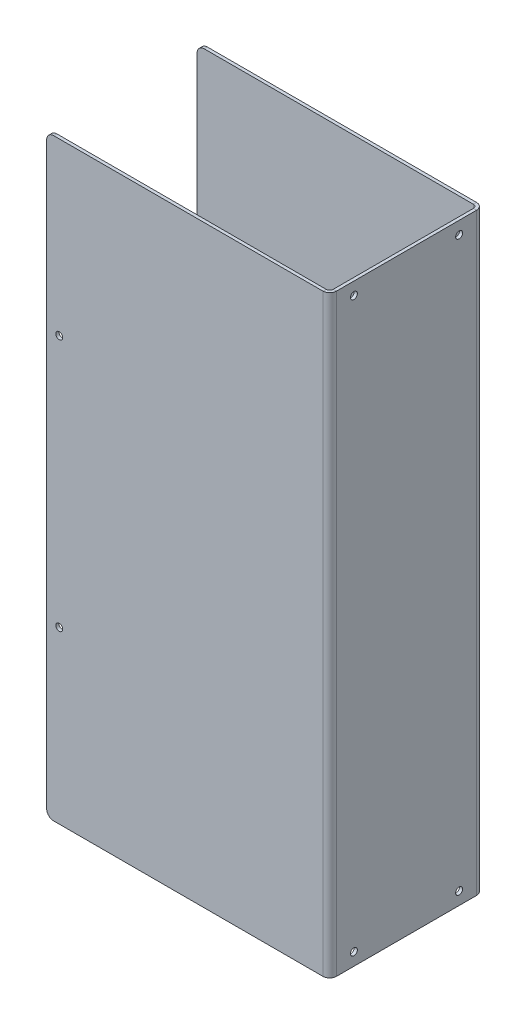
ISO-10303-21;
HEADER;
FILE_DESCRIPTION(('STEP AP214'),'2;1');
FILE_NAME('part.step','',(''),(''),'','','');
FILE_SCHEMA(('AUTOMOTIVE_DESIGN { 1 0 10303 214 1 1 1 1 }'));
ENDSEC;
DATA;
#1=APPLICATION_CONTEXT('core data for automotive mechanical design processes');
#2=APPLICATION_PROTOCOL_DEFINITION('international standard','automotive_design',2000,#1);
#3=PRODUCT_CONTEXT('',#1,'mechanical');
#4=PRODUCT('Part','Part','',(#3));
#5=PRODUCT_RELATED_PRODUCT_CATEGORY('part','',(#4));
#6=PRODUCT_DEFINITION_FORMATION('','',#4);
#7=PRODUCT_DEFINITION_CONTEXT('part definition',#1,'design');
#8=PRODUCT_DEFINITION('design','',#6,#7);
#9=PRODUCT_DEFINITION_SHAPE('','',#8);
#10=(LENGTH_UNIT() NAMED_UNIT(*) SI_UNIT(.MILLI.,.METRE.));
#11=(NAMED_UNIT(*) PLANE_ANGLE_UNIT() SI_UNIT($,.RADIAN.));
#12=(NAMED_UNIT(*) SI_UNIT($,.STERADIAN.) SOLID_ANGLE_UNIT());
#13=UNCERTAINTY_MEASURE_WITH_UNIT(LENGTH_MEASURE(1.E-05),#10,'distance_accuracy_value','');
#14=(GEOMETRIC_REPRESENTATION_CONTEXT(3) GLOBAL_UNCERTAINTY_ASSIGNED_CONTEXT((#13)) GLOBAL_UNIT_ASSIGNED_CONTEXT((#10,
#11,#12)) REPRESENTATION_CONTEXT('',''));
#15=CARTESIAN_POINT('',(0.,0.,0.));
#16=DIRECTION('',(0.,0.,1.));
#17=DIRECTION('',(1.,0.,0.));
#18=AXIS2_PLACEMENT_3D('',#15,#16,#17);
#19=CARTESIAN_POINT('',(133.000000004382,282.,-129.957079335618));
#20=DIRECTION('',(0.,1.,0.));
#21=DIRECTION('',(0.,0.,-1.));
#22=AXIS2_PLACEMENT_3D('',#19,#20,#21);
#23=PLANE('',#22);
#24=DIRECTION('',(0.,0.,-1.));
#25=VECTOR('',#24,1.);
#26=CARTESIAN_POINT('',(133.000000004382,282.,-129.957079335618));
#27=LINE('',#26,#25);
#28=CARTESIAN_POINT('',(133.000000004382,282.,68.300000008764));
#29=VERTEX_POINT('',#28);
#30=CARTESIAN_POINT('',(133.000000004382,282.,1.70000000000004));
#31=VERTEX_POINT('',#30);
#32=EDGE_CURVE('E326',#29,#31,#27,.T.);
#33=ORIENTED_EDGE('',*,*,#32,.F.);
#34=DIRECTION('',(1.,0.,0.));
#35=VECTOR('',#34,1.);
#36=CARTESIAN_POINT('',(133.000000004382,282.,68.3000000087641));
#37=LINE('',#36,#35);
#38=CARTESIAN_POINT('',(134.500000004382,282.,68.3000000087641));
#39=VERTEX_POINT('',#38);
#40=EDGE_CURVE('E12',#29,#39,#37,.T.);
#41=ORIENTED_EDGE('',*,*,#40,.T.);
#42=DIRECTION('',(0.,0.,1.));
#43=VECTOR('',#42,1.);
#44=CARTESIAN_POINT('',(134.500000004381,282.,199.957079344382));
#45=LINE('',#44,#43);
#46=CARTESIAN_POINT('',(134.500000004382,282.,1.70000000000006));
#47=VERTEX_POINT('',#46);
#48=EDGE_CURVE('E342',#39,#47,#45,.F.);
#49=ORIENTED_EDGE('',*,*,#48,.T.);
#50=DIRECTION('',(1.,0.,0.));
#51=VECTOR('',#50,1.);
#52=CARTESIAN_POINT('',(133.000000004382,282.,1.70000000000003));
#53=LINE('',#52,#51);
#54=EDGE_CURVE('E346',#31,#47,#53,.T.);
#55=ORIENTED_EDGE('',*,*,#54,.F.);
#56=EDGE_LOOP('',(#33,#41,#49,#55));
#57=FACE_BOUND('',#56,.T.);
#58=ADVANCED_FACE('F49',(#57),#23,.T.);
#59=CARTESIAN_POINT('',(133.000000004383,0.,-129.957079335618));
#60=DIRECTION('',(0.,-1.,0.));
#61=DIRECTION('',(0.,0.,1.));
#62=AXIS2_PLACEMENT_3D('',#59,#60,#61);
#63=PLANE('',#62);
#64=DIRECTION('',(0.,0.,1.));
#65=VECTOR('',#64,1.);
#66=CARTESIAN_POINT('',(134.500000004381,0.,199.957079344382));
#67=LINE('',#66,#65);
#68=CARTESIAN_POINT('',(134.500000004382,0.,1.70000000000003));
#69=VERTEX_POINT('',#68);
#70=CARTESIAN_POINT('',(134.500000004382,0.,68.300000008764));
#71=VERTEX_POINT('',#70);
#72=EDGE_CURVE('E73',#69,#71,#67,.T.);
#73=ORIENTED_EDGE('',*,*,#72,.T.);
#74=DIRECTION('',(-1.,0.,0.));
#75=VECTOR('',#74,1.);
#76=CARTESIAN_POINT('',(133.000000004382,0.,68.3000000087641));
#77=LINE('',#76,#75);
#78=CARTESIAN_POINT('',(133.000000004382,0.,68.300000008764));
#79=VERTEX_POINT('',#78);
#80=EDGE_CURVE('E357',#71,#79,#77,.T.);
#81=ORIENTED_EDGE('',*,*,#80,.T.);
#82=DIRECTION('',(0.,0.,1.));
#83=VECTOR('',#82,1.);
#84=CARTESIAN_POINT('',(133.000000004383,0.,-129.957079335618));
#85=LINE('',#84,#83);
#86=CARTESIAN_POINT('',(133.000000004382,0.,1.69999999999998));
#87=VERTEX_POINT('',#86);
#88=EDGE_CURVE('E52',#87,#79,#85,.T.);
#89=ORIENTED_EDGE('',*,*,#88,.F.);
#90=DIRECTION('',(-1.,0.,0.));
#91=VECTOR('',#90,1.);
#92=CARTESIAN_POINT('',(133.000000004382,0.,1.70000000000003));
#93=LINE('',#92,#91);
#94=EDGE_CURVE('E351',#69,#87,#93,.T.);
#95=ORIENTED_EDGE('',*,*,#94,.F.);
#96=EDGE_LOOP('',(#73,#81,#89,#95));
#97=FACE_BOUND('',#96,.T.);
#98=ADVANCED_FACE('F377',(#97),#63,.T.);
#99=CARTESIAN_POINT('',(133.000000004381,3.34999999999997,199.957079344382));
#100=DIRECTION('',(-1.,0.,0.));
#101=DIRECTION('',(0.,0.,1.));
#102=AXIS2_PLACEMENT_3D('',#99,#100,#101);
#103=PLANE('',#102);
#104=CARTESIAN_POINT('',(133.000000004382,5.99999999999988,60.0000000043822));
#105=DIRECTION('',(-1.,0.,0.));
#106=DIRECTION('',(0.,0.,1.));
#107=AXIS2_PLACEMENT_3D('',#104,#105,#106);
#108=CIRCLE('',#107,1.64999999999999);
#109=CARTESIAN_POINT('',(133.000000004382,5.99999999999988,61.6500000043822));
#110=VERTEX_POINT('',#109);
#111=EDGE_CURVE('E322',#110,#110,#108,.T.);
#112=ORIENTED_EDGE('',*,*,#111,.F.);
#113=EDGE_LOOP('',(#112));
#114=FACE_BOUND('',#113,.T.);
#115=CARTESIAN_POINT('',(133.000000004382,5.99999999999988,10.0000000043818));
#116=DIRECTION('',(-1.,0.,0.));
#117=DIRECTION('',(0.,0.,1.));
#118=AXIS2_PLACEMENT_3D('',#115,#116,#117);
#119=CIRCLE('',#118,1.65000000000002);
#120=CARTESIAN_POINT('',(133.000000004382,5.99999999999988,11.6500000043818));
#121=VERTEX_POINT('',#120);
#122=EDGE_CURVE('E318',#121,#121,#119,.T.);
#123=ORIENTED_EDGE('',*,*,#122,.F.);
#124=EDGE_LOOP('',(#123));
#125=FACE_BOUND('',#124,.T.);
#126=CARTESIAN_POINT('',(133.000000004382,276.,60.0000000043822));
#127=DIRECTION('',(-1.,0.,0.));
#128=DIRECTION('',(0.,0.,1.));
#129=AXIS2_PLACEMENT_3D('',#126,#127,#128);
#130=CIRCLE('',#129,1.64999999999999);
#131=CARTESIAN_POINT('',(133.000000004382,276.,61.6500000043822));
#132=VERTEX_POINT('',#131);
#133=EDGE_CURVE('E314',#132,#132,#130,.T.);
#134=ORIENTED_EDGE('',*,*,#133,.F.);
#135=EDGE_LOOP('',(#134));
#136=FACE_BOUND('',#135,.T.);
#137=CARTESIAN_POINT('',(133.000000004382,276.,10.0000000043818));
#138=DIRECTION('',(-1.,0.,0.));
#139=DIRECTION('',(0.,0.,1.));
#140=AXIS2_PLACEMENT_3D('',#137,#138,#139);
#141=CIRCLE('',#140,1.64999999999999);
#142=CARTESIAN_POINT('',(133.000000004382,276.,11.6500000043818));
#143=VERTEX_POINT('',#142);
#144=EDGE_CURVE('E310',#143,#143,#141,.T.);
#145=ORIENTED_EDGE('',*,*,#144,.F.);
#146=EDGE_LOOP('',(#145));
#147=FACE_BOUND('',#146,.T.);
#148=ORIENTED_EDGE('',*,*,#88,.T.);
#149=DIRECTION('',(0.,1.,0.));
#150=VECTOR('',#149,1.);
#151=CARTESIAN_POINT('',(133.000000004382,3.34999999999997,68.3000000087641));
#152=LINE('',#151,#150);
#153=EDGE_CURVE('E354',#79,#29,#152,.T.);
#154=ORIENTED_EDGE('',*,*,#153,.T.);
#155=ORIENTED_EDGE('',*,*,#32,.T.);
#156=DIRECTION('',(0.,1.,0.));
#157=VECTOR('',#156,1.);
#158=CARTESIAN_POINT('',(133.000000004382,3.34999999999997,1.70000000000003));
#159=LINE('',#158,#157);
#160=EDGE_CURVE('E343',#87,#31,#159,.T.);
#161=ORIENTED_EDGE('',*,*,#160,.F.);
#162=EDGE_LOOP('',(#148,#154,#155,#161));
#163=FACE_BOUND('',#162,.T.);
#164=ADVANCED_FACE('F375',(#114,#125,#136,#147,#163),#103,.T.);
#165=CARTESIAN_POINT('',(134.500000004381,3.34999999999997,199.957079344382));
#166=DIRECTION('',(-1.,0.,0.));
#167=DIRECTION('',(0.,0.,1.));
#168=AXIS2_PLACEMENT_3D('',#165,#166,#167);
#169=PLANE('',#168);
#170=DIRECTION('',(0.,1.,0.));
#171=VECTOR('',#170,1.);
#172=CARTESIAN_POINT('',(134.500000004382,3.34999999999997,68.3000000087641));
#173=LINE('',#172,#171);
#174=EDGE_CURVE('E57',#71,#39,#173,.T.);
#175=ORIENTED_EDGE('',*,*,#174,.F.);
#176=ORIENTED_EDGE('',*,*,#72,.F.);
#177=DIRECTION('',(0.,1.,0.));
#178=VECTOR('',#177,1.);
#179=CARTESIAN_POINT('',(134.500000004382,3.34999999999997,1.70000000000003));
#180=LINE('',#179,#178);
#181=EDGE_CURVE('E349',#69,#47,#180,.T.);
#182=ORIENTED_EDGE('',*,*,#181,.T.);
#183=ORIENTED_EDGE('',*,*,#48,.F.);
#184=EDGE_LOOP('',(#175,#176,#182,#183));
#185=FACE_BOUND('',#184,.T.);
#186=CARTESIAN_POINT('',(134.500000004382,5.99999999999988,60.0000000043822));
#187=DIRECTION('',(-1.,0.,0.));
#188=DIRECTION('',(0.,0.,1.));
#189=AXIS2_PLACEMENT_3D('',#186,#187,#188);
#190=CIRCLE('',#189,1.64999999999999);
#191=CARTESIAN_POINT('',(134.500000004382,5.99999999999988,61.6500000043822));
#192=VERTEX_POINT('',#191);
#193=EDGE_CURVE('E338',#192,#192,#190,.T.);
#194=ORIENTED_EDGE('',*,*,#193,.T.);
#195=EDGE_LOOP('',(#194));
#196=FACE_BOUND('',#195,.T.);
#197=CARTESIAN_POINT('',(134.500000004382,5.99999999999988,10.0000000043818));
#198=DIRECTION('',(-1.,0.,0.));
#199=DIRECTION('',(0.,0.,1.));
#200=AXIS2_PLACEMENT_3D('',#197,#198,#199);
#201=CIRCLE('',#200,1.65000000000002);
#202=CARTESIAN_POINT('',(134.500000004382,5.99999999999988,11.6500000043818));
#203=VERTEX_POINT('',#202);
#204=EDGE_CURVE('E334',#203,#203,#201,.T.);
#205=ORIENTED_EDGE('',*,*,#204,.T.);
#206=EDGE_LOOP('',(#205));
#207=FACE_BOUND('',#206,.T.);
#208=CARTESIAN_POINT('',(134.500000004382,276.,60.0000000043822));
#209=DIRECTION('',(-1.,0.,0.));
#210=DIRECTION('',(0.,0.,1.));
#211=AXIS2_PLACEMENT_3D('',#208,#209,#210);
#212=CIRCLE('',#211,1.64999999999999);
#213=CARTESIAN_POINT('',(134.500000004382,276.,61.6500000043822));
#214=VERTEX_POINT('',#213);
#215=EDGE_CURVE('E330',#214,#214,#212,.T.);
#216=ORIENTED_EDGE('',*,*,#215,.T.);
#217=EDGE_LOOP('',(#216));
#218=FACE_BOUND('',#217,.T.);
#219=CARTESIAN_POINT('',(134.500000004382,276.,10.0000000043818));
#220=DIRECTION('',(-1.,0.,0.));
#221=DIRECTION('',(0.,0.,1.));
#222=AXIS2_PLACEMENT_3D('',#219,#220,#221);
#223=CIRCLE('',#222,1.64999999999999);
#224=CARTESIAN_POINT('',(134.500000004382,276.,11.6500000043818));
#225=VERTEX_POINT('',#224);
#226=EDGE_CURVE('E238',#225,#225,#223,.T.);
#227=ORIENTED_EDGE('',*,*,#226,.T.);
#228=EDGE_LOOP('',(#227));
#229=FACE_BOUND('',#228,.T.);
#230=ADVANCED_FACE('F490',(#185,#196,#207,#218,#229),#169,.F.);
#231=CARTESIAN_POINT('',(133.000000004382,276.,10.0000000043818));
#232=DIRECTION('',(-1.,0.,0.));
#233=DIRECTION('',(0.,0.,1.));
#234=AXIS2_PLACEMENT_3D('',#231,#232,#233);
#235=CYLINDRICAL_SURFACE('',#234,1.64999999999999);
#236=ORIENTED_EDGE('',*,*,#144,.T.);
#237=EDGE_LOOP('',(#236));
#238=FACE_BOUND('',#237,.T.);
#239=ORIENTED_EDGE('',*,*,#226,.F.);
#240=EDGE_LOOP('',(#239));
#241=FACE_BOUND('',#240,.T.);
#242=ADVANCED_FACE('F495',(#238,#241),#235,.F.);
#243=CARTESIAN_POINT('',(133.000000004382,276.,60.0000000043822));
#244=DIRECTION('',(-1.,0.,0.));
#245=DIRECTION('',(0.,0.,1.));
#246=AXIS2_PLACEMENT_3D('',#243,#244,#245);
#247=CYLINDRICAL_SURFACE('',#246,1.64999999999999);
#248=ORIENTED_EDGE('',*,*,#133,.T.);
#249=EDGE_LOOP('',(#248));
#250=FACE_BOUND('',#249,.T.);
#251=ORIENTED_EDGE('',*,*,#215,.F.);
#252=EDGE_LOOP('',(#251));
#253=FACE_BOUND('',#252,.T.);
#254=ADVANCED_FACE('F499',(#250,#253),#247,.F.);
#255=CARTESIAN_POINT('',(133.000000004382,5.99999999999988,10.0000000043818));
#256=DIRECTION('',(-1.,0.,0.));
#257=DIRECTION('',(0.,0.,1.));
#258=AXIS2_PLACEMENT_3D('',#255,#256,#257);
#259=CYLINDRICAL_SURFACE('',#258,1.65000000000002);
#260=ORIENTED_EDGE('',*,*,#122,.T.);
#261=EDGE_LOOP('',(#260));
#262=FACE_BOUND('',#261,.T.);
#263=ORIENTED_EDGE('',*,*,#204,.F.);
#264=EDGE_LOOP('',(#263));
#265=FACE_BOUND('',#264,.T.);
#266=ADVANCED_FACE('F513',(#262,#265),#259,.F.);
#267=CARTESIAN_POINT('',(133.000000004382,5.99999999999988,60.0000000043822));
#268=DIRECTION('',(-1.,0.,0.));
#269=DIRECTION('',(0.,0.,1.));
#270=AXIS2_PLACEMENT_3D('',#267,#268,#269);
#271=CYLINDRICAL_SURFACE('',#270,1.64999999999999);
#272=ORIENTED_EDGE('',*,*,#111,.T.);
#273=EDGE_LOOP('',(#272));
#274=FACE_BOUND('',#273,.T.);
#275=ORIENTED_EDGE('',*,*,#193,.F.);
#276=EDGE_LOOP('',(#275));
#277=FACE_BOUND('',#276,.T.);
#278=ADVANCED_FACE('F519',(#274,#277),#271,.F.);
#279=CARTESIAN_POINT('',(3.35,3.35,0.));
#280=DIRECTION('',(0.,0.,1.));
#281=DIRECTION('',(1.,0.,0.));
#282=AXIS2_PLACEMENT_3D('',#279,#280,#281);
#283=CYLINDRICAL_SURFACE('',#282,3.35);
#284=DIRECTION('',(0.,0.,1.));
#285=VECTOR('',#284,1.);
#286=CARTESIAN_POINT('',(0.,3.35,0.));
#287=LINE('',#286,#285);
#288=CARTESIAN_POINT('',(0.,3.35,-1.5));
#289=VERTEX_POINT('',#288);
#290=CARTESIAN_POINT('',(0.,3.35,0.));
#291=VERTEX_POINT('',#290);
#292=EDGE_CURVE('E296',#289,#291,#287,.T.);
#293=ORIENTED_EDGE('',*,*,#292,.F.);
#294=CARTESIAN_POINT('',(3.35,3.35,-1.5));
#295=DIRECTION('',(0.,0.,1.));
#296=DIRECTION('',(1.,0.,0.));
#297=AXIS2_PLACEMENT_3D('',#294,#295,#296);
#298=CIRCLE('',#297,3.35);
#299=CARTESIAN_POINT('',(3.35000000000002,0.,-1.5));
#300=VERTEX_POINT('',#299);
#301=EDGE_CURVE('E304',#289,#300,#298,.T.);
#302=ORIENTED_EDGE('',*,*,#301,.T.);
#303=DIRECTION('',(0.,0.,1.));
#304=VECTOR('',#303,1.);
#305=CARTESIAN_POINT('',(3.35000000000002,0.,0.));
#306=LINE('',#305,#304);
#307=CARTESIAN_POINT('',(3.35000000000002,0.,0.));
#308=VERTEX_POINT('',#307);
#309=EDGE_CURVE('E302',#300,#308,#306,.T.);
#310=ORIENTED_EDGE('',*,*,#309,.T.);
#311=CARTESIAN_POINT('',(3.35,3.35,0.));
#312=DIRECTION('',(0.,0.,1.));
#313=DIRECTION('',(-1.,0.,0.));
#314=AXIS2_PLACEMENT_3D('',#311,#312,#313);
#315=CIRCLE('',#314,3.35);
#316=EDGE_CURVE('E260',#291,#308,#315,.T.);
#317=ORIENTED_EDGE('',*,*,#316,.F.);
#318=EDGE_LOOP('',(#293,#302,#310,#317));
#319=FACE_BOUND('',#318,.T.);
#320=ADVANCED_FACE('F523',(#319),#283,.T.);
#321=CARTESIAN_POINT('',(0.,3.35000000000002,0.));
#322=DIRECTION('',(-1.,0.,0.));
#323=DIRECTION('',(0.,-1.,0.));
#324=AXIS2_PLACEMENT_3D('',#321,#322,#323);
#325=PLANE('',#324);
#326=DIRECTION('',(0.,0.,1.));
#327=VECTOR('',#326,1.);
#328=CARTESIAN_POINT('',(0.,278.65,0.));
#329=LINE('',#328,#327);
#330=CARTESIAN_POINT('',(0.,278.65,-1.5));
#331=VERTEX_POINT('',#330);
#332=CARTESIAN_POINT('',(0.,278.65,0.));
#333=VERTEX_POINT('',#332);
#334=EDGE_CURVE('E290',#331,#333,#329,.T.);
#335=ORIENTED_EDGE('',*,*,#334,.F.);
#336=DIRECTION('',(0.,1.,0.));
#337=VECTOR('',#336,1.);
#338=CARTESIAN_POINT('',(0.,3.35,-1.5));
#339=LINE('',#338,#337);
#340=EDGE_CURVE('E298',#331,#289,#339,.F.);
#341=ORIENTED_EDGE('',*,*,#340,.T.);
#342=ORIENTED_EDGE('',*,*,#292,.T.);
#343=DIRECTION('',(0.,-1.,0.));
#344=VECTOR('',#343,1.);
#345=CARTESIAN_POINT('',(0.,3.35000000000002,0.));
#346=LINE('',#345,#344);
#347=EDGE_CURVE('E264',#333,#291,#346,.T.);
#348=ORIENTED_EDGE('',*,*,#347,.F.);
#349=EDGE_LOOP('',(#335,#341,#342,#348));
#350=FACE_BOUND('',#349,.T.);
#351=ADVANCED_FACE('F528',(#350),#325,.T.);
#352=CARTESIAN_POINT('',(3.35,278.65,0.));
#353=DIRECTION('',(0.,0.,1.));
#354=DIRECTION('',(1.,0.,0.));
#355=AXIS2_PLACEMENT_3D('',#352,#353,#354);
#356=CYLINDRICAL_SURFACE('',#355,3.35000000000001);
#357=DIRECTION('',(0.,0.,1.));
#358=VECTOR('',#357,1.);
#359=CARTESIAN_POINT('',(3.35000000000002,282.,0.));
#360=LINE('',#359,#358);
#361=CARTESIAN_POINT('',(3.35000000000002,282.,-1.5));
#362=VERTEX_POINT('',#361);
#363=CARTESIAN_POINT('',(3.35000000000002,282.,0.));
#364=VERTEX_POINT('',#363);
#365=EDGE_CURVE('E251',#362,#364,#360,.T.);
#366=ORIENTED_EDGE('',*,*,#365,.F.);
#367=CARTESIAN_POINT('',(3.35,278.65,-1.5));
#368=DIRECTION('',(0.,0.,1.));
#369=DIRECTION('',(1.,0.,0.));
#370=AXIS2_PLACEMENT_3D('',#367,#368,#369);
#371=CIRCLE('',#370,3.35000000000001);
#372=EDGE_CURVE('E292',#362,#331,#371,.T.);
#373=ORIENTED_EDGE('',*,*,#372,.T.);
#374=ORIENTED_EDGE('',*,*,#334,.T.);
#375=CARTESIAN_POINT('',(3.35,278.65,0.));
#376=DIRECTION('',(0.,0.,1.));
#377=DIRECTION('',(-1.,0.,0.));
#378=AXIS2_PLACEMENT_3D('',#375,#376,#377);
#379=CIRCLE('',#378,3.35000000000001);
#380=EDGE_CURVE('E268',#364,#333,#379,.T.);
#381=ORIENTED_EDGE('',*,*,#380,.F.);
#382=EDGE_LOOP('',(#366,#373,#374,#381));
#383=FACE_BOUND('',#382,.T.);
#384=ADVANCED_FACE('F543',(#383),#356,.T.);
#385=CARTESIAN_POINT('',(5.99999999999983,81.0000000000001,0.));
#386=DIRECTION('',(0.,0.,1.));
#387=DIRECTION('',(1.,0.,0.));
#388=AXIS2_PLACEMENT_3D('',#385,#386,#387);
#389=CYLINDRICAL_SURFACE('',#388,1.65000000000002);
#390=CARTESIAN_POINT('',(5.99999999999983,81.0000000000001,0.));
#391=DIRECTION('',(0.,0.,1.));
#392=DIRECTION('',(1.,0.,0.));
#393=AXIS2_PLACEMENT_3D('',#390,#391,#392);
#394=CIRCLE('',#393,1.65000000000002);
#395=CARTESIAN_POINT('',(7.64999999999984,81.0000000000001,0.));
#396=VERTEX_POINT('',#395);
#397=EDGE_CURVE('E286',#396,#396,#394,.T.);
#398=ORIENTED_EDGE('',*,*,#397,.T.);
#399=EDGE_LOOP('',(#398));
#400=FACE_BOUND('',#399,.T.);
#401=CARTESIAN_POINT('',(5.99999999999983,81.0000000000001,-1.5));
#402=DIRECTION('',(0.,0.,1.));
#403=DIRECTION('',(1.,0.,0.));
#404=AXIS2_PLACEMENT_3D('',#401,#402,#403);
#405=CIRCLE('',#404,1.65000000000002);
#406=CARTESIAN_POINT('',(7.64999999999984,81.0000000000001,-1.5));
#407=VERTEX_POINT('',#406);
#408=EDGE_CURVE('E247',#407,#407,#405,.T.);
#409=ORIENTED_EDGE('',*,*,#408,.F.);
#410=EDGE_LOOP('',(#409));
#411=FACE_BOUND('',#410,.T.);
#412=ADVANCED_FACE('F549',(#400,#411),#389,.F.);
#413=CARTESIAN_POINT('',(5.9999999999998,201.,0.));
#414=DIRECTION('',(0.,0.,1.));
#415=DIRECTION('',(1.,0.,0.));
#416=AXIS2_PLACEMENT_3D('',#413,#414,#415);
#417=CYLINDRICAL_SURFACE('',#416,1.64999999999998);
#418=CARTESIAN_POINT('',(5.9999999999998,201.,0.));
#419=DIRECTION('',(0.,0.,1.));
#420=DIRECTION('',(1.,0.,0.));
#421=AXIS2_PLACEMENT_3D('',#418,#419,#420);
#422=CIRCLE('',#421,1.64999999999998);
#423=CARTESIAN_POINT('',(7.64999999999978,201.,0.));
#424=VERTEX_POINT('',#423);
#425=EDGE_CURVE('E282',#424,#424,#422,.T.);
#426=ORIENTED_EDGE('',*,*,#425,.T.);
#427=EDGE_LOOP('',(#426));
#428=FACE_BOUND('',#427,.T.);
#429=CARTESIAN_POINT('',(5.9999999999998,201.,-1.5));
#430=DIRECTION('',(0.,0.,1.));
#431=DIRECTION('',(1.,0.,0.));
#432=AXIS2_PLACEMENT_3D('',#429,#430,#431);
#433=CIRCLE('',#432,1.64999999999998);
#434=CARTESIAN_POINT('',(7.64999999999978,201.,-1.5));
#435=VERTEX_POINT('',#434);
#436=EDGE_CURVE('E243',#435,#435,#433,.T.);
#437=ORIENTED_EDGE('',*,*,#436,.F.);
#438=EDGE_LOOP('',(#437));
#439=FACE_BOUND('',#438,.T.);
#440=ADVANCED_FACE('F553',(#428,#439),#417,.F.);
#441=CARTESIAN_POINT('',(333.26415868,3.35,0.));
#442=DIRECTION('',(0.,0.,1.));
#443=DIRECTION('',(1.,0.,0.));
#444=AXIS2_PLACEMENT_3D('',#441,#442,#443);
#445=PLANE('',#444);
#446=ORIENTED_EDGE('',*,*,#425,.F.);
#447=EDGE_LOOP('',(#446));
#448=FACE_BOUND('',#447,.T.);
#449=ORIENTED_EDGE('',*,*,#397,.F.);
#450=EDGE_LOOP('',(#449));
#451=FACE_BOUND('',#450,.T.);
#452=DIRECTION('',(1.,0.,0.));
#453=VECTOR('',#452,1.);
#454=CARTESIAN_POINT('',(3.35000000000002,0.,0.));
#455=LINE('',#454,#453);
#456=CARTESIAN_POINT('',(131.300000004382,0.,0.));
#457=VERTEX_POINT('',#456);
#458=EDGE_CURVE('E278',#308,#457,#455,.T.);
#459=ORIENTED_EDGE('',*,*,#458,.T.);
#460=DIRECTION('',(0.,1.,0.));
#461=VECTOR('',#460,1.);
#462=CARTESIAN_POINT('',(131.300000004382,3.34999999999998,0.));
#463=LINE('',#462,#461);
#464=CARTESIAN_POINT('',(131.300000004382,282.,0.));
#465=VERTEX_POINT('',#464);
#466=EDGE_CURVE('E275',#457,#465,#463,.T.);
#467=ORIENTED_EDGE('',*,*,#466,.T.);
#468=DIRECTION('',(-1.,0.,0.));
#469=VECTOR('',#468,1.);
#470=CARTESIAN_POINT('',(3.35000000000002,282.,0.));
#471=LINE('',#470,#469);
#472=EDGE_CURVE('E272',#465,#364,#471,.T.);
#473=ORIENTED_EDGE('',*,*,#472,.T.);
#474=ORIENTED_EDGE('',*,*,#380,.T.);
#475=ORIENTED_EDGE('',*,*,#347,.T.);
#476=ORIENTED_EDGE('',*,*,#316,.T.);
#477=EDGE_LOOP('',(#459,#467,#473,#474,#475,#476));
#478=FACE_BOUND('',#477,.T.);
#479=ADVANCED_FACE('F466',(#448,#451,#478),#445,.T.);
#480=CARTESIAN_POINT('',(3.35000000000002,282.,0.));
#481=DIRECTION('',(0.,1.,0.));
#482=DIRECTION('',(-1.,0.,0.));
#483=AXIS2_PLACEMENT_3D('',#480,#481,#482);
#484=PLANE('',#483);
#485=ORIENTED_EDGE('',*,*,#472,.F.);
#486=DIRECTION('',(0.,0.,-1.));
#487=VECTOR('',#486,1.);
#488=CARTESIAN_POINT('',(131.300000004382,282.,0.));
#489=LINE('',#488,#487);
#490=CARTESIAN_POINT('',(131.300000004382,282.,-1.5));
#491=VERTEX_POINT('',#490);
#492=EDGE_CURVE('E257',#465,#491,#489,.T.);
#493=ORIENTED_EDGE('',*,*,#492,.T.);
#494=DIRECTION('',(1.,0.,0.));
#495=VECTOR('',#494,1.);
#496=CARTESIAN_POINT('',(333.26415868,282.,-1.5));
#497=LINE('',#496,#495);
#498=EDGE_CURVE('E254',#491,#362,#497,.F.);
#499=ORIENTED_EDGE('',*,*,#498,.T.);
#500=ORIENTED_EDGE('',*,*,#365,.T.);
#501=EDGE_LOOP('',(#485,#493,#499,#500));
#502=FACE_BOUND('',#501,.T.);
#503=ADVANCED_FACE('F461',(#502),#484,.T.);
#504=CARTESIAN_POINT('',(333.26415868,3.35,-1.5));
#505=DIRECTION('',(0.,0.,1.));
#506=DIRECTION('',(1.,0.,0.));
#507=AXIS2_PLACEMENT_3D('',#504,#505,#506);
#508=PLANE('',#507);
#509=DIRECTION('',(0.,1.,0.));
#510=VECTOR('',#509,1.);
#511=CARTESIAN_POINT('',(131.300000004382,3.34999999999998,-1.5));
#512=LINE('',#511,#510);
#513=CARTESIAN_POINT('',(131.300000004382,0.,-1.5));
#514=VERTEX_POINT('',#513);
#515=EDGE_CURVE('E231',#514,#491,#512,.T.);
#516=ORIENTED_EDGE('',*,*,#515,.F.);
#517=DIRECTION('',(1.,0.,0.));
#518=VECTOR('',#517,1.);
#519=CARTESIAN_POINT('',(333.26415868,0.,-1.5));
#520=LINE('',#519,#518);
#521=EDGE_CURVE('E239',#300,#514,#520,.T.);
#522=ORIENTED_EDGE('',*,*,#521,.F.);
#523=ORIENTED_EDGE('',*,*,#301,.F.);
#524=ORIENTED_EDGE('',*,*,#340,.F.);
#525=ORIENTED_EDGE('',*,*,#372,.F.);
#526=ORIENTED_EDGE('',*,*,#498,.F.);
#527=EDGE_LOOP('',(#516,#522,#523,#524,#525,#526));
#528=FACE_BOUND('',#527,.T.);
#529=ORIENTED_EDGE('',*,*,#408,.T.);
#530=EDGE_LOOP('',(#529));
#531=FACE_BOUND('',#530,.T.);
#532=ORIENTED_EDGE('',*,*,#436,.T.);
#533=EDGE_LOOP('',(#532));
#534=FACE_BOUND('',#533,.T.);
#535=ADVANCED_FACE('F455',(#528,#531,#534),#508,.F.);
#536=CARTESIAN_POINT('',(3.35000000000002,0.,0.));
#537=DIRECTION('',(0.,-1.,0.));
#538=DIRECTION('',(1.,0.,0.));
#539=AXIS2_PLACEMENT_3D('',#536,#537,#538);
#540=PLANE('',#539);
#541=ORIENTED_EDGE('',*,*,#521,.T.);
#542=DIRECTION('',(0.,0.,1.));
#543=VECTOR('',#542,1.);
#544=CARTESIAN_POINT('',(131.300000004382,0.,0.));
#545=LINE('',#544,#543);
#546=EDGE_CURVE('E235',#514,#457,#545,.T.);
#547=ORIENTED_EDGE('',*,*,#546,.T.);
#548=ORIENTED_EDGE('',*,*,#458,.F.);
#549=ORIENTED_EDGE('',*,*,#309,.F.);
#550=EDGE_LOOP('',(#541,#547,#548,#549));
#551=FACE_BOUND('',#550,.T.);
#552=ADVANCED_FACE('F470',(#551),#540,.T.);
#553=CARTESIAN_POINT('',(131.300000004382,0.,1.7));
#554=DIRECTION('',(0.,1.,0.));
#555=DIRECTION('',(-1.,0.,0.));
#556=AXIS2_PLACEMENT_3D('',#553,#554,#555);
#557=PLANE('',#556);
#558=ORIENTED_EDGE('',*,*,#546,.F.);
#559=CARTESIAN_POINT('',(131.300000004382,0.,1.7));
#560=DIRECTION('',(0.,1.,0.));
#561=DIRECTION('',(-1.,0.,0.));
#562=AXIS2_PLACEMENT_3D('',#559,#560,#561);
#563=CIRCLE('',#562,3.2);
#564=EDGE_CURVE('E220',#514,#69,#563,.F.);
#565=ORIENTED_EDGE('',*,*,#564,.T.);
#566=ORIENTED_EDGE('',*,*,#94,.T.);
#567=CARTESIAN_POINT('',(131.300000004382,0.,1.7));
#568=DIRECTION('',(0.,-1.,0.));
#569=DIRECTION('',(1.,0.,0.));
#570=AXIS2_PLACEMENT_3D('',#567,#568,#569);
#571=CIRCLE('',#570,1.69999999999999);
#572=EDGE_CURVE('E224',#457,#87,#571,.T.);
#573=ORIENTED_EDGE('',*,*,#572,.F.);
#574=EDGE_LOOP('',(#558,#565,#566,#573));
#575=FACE_BOUND('',#574,.T.);
#576=ADVANCED_FACE('F472',(#575),#557,.F.);
#577=CARTESIAN_POINT('',(131.300000004382,282.,1.7));
#578=DIRECTION('',(0.,-1.,0.));
#579=DIRECTION('',(0.,0.,-1.));
#580=AXIS2_PLACEMENT_3D('',#577,#578,#579);
#581=PLANE('',#580);
#582=CARTESIAN_POINT('',(131.300000004382,282.,1.7));
#583=DIRECTION('',(0.,1.,0.));
#584=DIRECTION('',(-1.,0.,0.));
#585=AXIS2_PLACEMENT_3D('',#582,#583,#584);
#586=CIRCLE('',#585,3.2);
#587=EDGE_CURVE('E228',#47,#491,#586,.T.);
#588=ORIENTED_EDGE('',*,*,#587,.T.);
#589=ORIENTED_EDGE('',*,*,#492,.F.);
#590=CARTESIAN_POINT('',(131.300000004382,282.,1.7));
#591=DIRECTION('',(0.,1.,0.));
#592=DIRECTION('',(0.,0.,1.));
#593=AXIS2_PLACEMENT_3D('',#590,#591,#592);
#594=CIRCLE('',#593,1.69999999999999);
#595=EDGE_CURVE('E227',#31,#465,#594,.T.);
#596=ORIENTED_EDGE('',*,*,#595,.F.);
#597=ORIENTED_EDGE('',*,*,#54,.T.);
#598=EDGE_LOOP('',(#588,#589,#596,#597));
#599=FACE_BOUND('',#598,.T.);
#600=ADVANCED_FACE('F445',(#599),#581,.F.);
#601=CARTESIAN_POINT('',(131.300000004382,-141.028353959612,1.7));
#602=DIRECTION('',(0.,1.,0.));
#603=DIRECTION('',(-1.,0.,0.));
#604=AXIS2_PLACEMENT_3D('',#601,#602,#603);
#605=CYLINDRICAL_SURFACE('',#604,1.7);
#606=ORIENTED_EDGE('',*,*,#160,.T.);
#607=ORIENTED_EDGE('',*,*,#595,.T.);
#608=ORIENTED_EDGE('',*,*,#466,.F.);
#609=ORIENTED_EDGE('',*,*,#572,.T.);
#610=EDGE_LOOP('',(#606,#607,#608,#609));
#611=FACE_BOUND('',#610,.T.);
#612=ADVANCED_FACE('F463',(#611),#605,.F.);
#613=CARTESIAN_POINT('',(131.300000004382,-141.028353959612,1.7));
#614=DIRECTION('',(0.,1.,0.));
#615=DIRECTION('',(-1.,0.,0.));
#616=AXIS2_PLACEMENT_3D('',#613,#614,#615);
#617=CYLINDRICAL_SURFACE('',#616,3.2);
#618=ORIENTED_EDGE('',*,*,#181,.F.);
#619=ORIENTED_EDGE('',*,*,#564,.F.);
#620=ORIENTED_EDGE('',*,*,#515,.T.);
#621=ORIENTED_EDGE('',*,*,#587,.F.);
#622=EDGE_LOOP('',(#618,#619,#620,#621));
#623=FACE_BOUND('',#622,.T.);
#624=ADVANCED_FACE('F448',(#623),#617,.T.);
#625=CARTESIAN_POINT('',(131.300000004382,0.,68.3000000087641));
#626=DIRECTION('',(0.,1.,0.));
#627=DIRECTION('',(-1.,0.,0.));
#628=AXIS2_PLACEMENT_3D('',#625,#626,#627);
#629=PLANE('',#628);
#630=ORIENTED_EDGE('',*,*,#80,.F.);
#631=CARTESIAN_POINT('',(131.300000004382,0.,68.3000000087641));
#632=DIRECTION('',(0.,1.,0.));
#633=DIRECTION('',(-1.,0.,0.));
#634=AXIS2_PLACEMENT_3D('',#631,#632,#633);
#635=CIRCLE('',#634,3.2);
#636=CARTESIAN_POINT('',(131.300000004382,0.,71.5000000087641));
#637=VERTEX_POINT('',#636);
#638=EDGE_CURVE('E187',#71,#637,#635,.F.);
#639=ORIENTED_EDGE('',*,*,#638,.T.);
#640=DIRECTION('',(0.,0.,-1.));
#641=VECTOR('',#640,1.);
#642=CARTESIAN_POINT('',(131.300000004382,0.,70.0000000087641));
#643=LINE('',#642,#641);
#644=CARTESIAN_POINT('',(131.300000004382,0.,70.0000000087641));
#645=VERTEX_POINT('',#644);
#646=EDGE_CURVE('E206',#637,#645,#643,.T.);
#647=ORIENTED_EDGE('',*,*,#646,.T.);
#648=CARTESIAN_POINT('',(131.300000004382,0.,68.3000000087641));
#649=DIRECTION('',(0.,-1.,0.));
#650=DIRECTION('',(1.,0.,0.));
#651=AXIS2_PLACEMENT_3D('',#648,#649,#650);
#652=CIRCLE('',#651,1.69999999999999);
#653=EDGE_CURVE('E214',#79,#645,#652,.T.);
#654=ORIENTED_EDGE('',*,*,#653,.F.);
#655=EDGE_LOOP('',(#630,#639,#647,#654));
#656=FACE_BOUND('',#655,.T.);
#657=ADVANCED_FACE('F381',(#656),#629,.F.);
#658=CARTESIAN_POINT('',(131.300000004382,282.,68.3000000087641));
#659=DIRECTION('',(0.,-1.,0.));
#660=DIRECTION('',(0.,0.,-1.));
#661=AXIS2_PLACEMENT_3D('',#658,#659,#660);
#662=PLANE('',#661);
#663=CARTESIAN_POINT('',(131.300000004382,282.,68.3000000087641));
#664=DIRECTION('',(0.,1.,0.));
#665=DIRECTION('',(-1.,0.,0.));
#666=AXIS2_PLACEMENT_3D('',#663,#664,#665);
#667=CIRCLE('',#666,3.2);
#668=CARTESIAN_POINT('',(131.300000004382,282.,71.5000000087641));
#669=VERTEX_POINT('',#668);
#670=EDGE_CURVE('E65',#669,#39,#667,.T.);
#671=ORIENTED_EDGE('',*,*,#670,.T.);
#672=ORIENTED_EDGE('',*,*,#40,.F.);
#673=CARTESIAN_POINT('',(131.300000004382,282.,68.3000000087641));
#674=DIRECTION('',(0.,1.,0.));
#675=DIRECTION('',(0.,0.,1.));
#676=AXIS2_PLACEMENT_3D('',#673,#674,#675);
#677=CIRCLE('',#676,1.69999999999999);
#678=CARTESIAN_POINT('',(131.300000004382,282.,70.0000000087641));
#679=VERTEX_POINT('',#678);
#680=EDGE_CURVE('E217',#679,#29,#677,.T.);
#681=ORIENTED_EDGE('',*,*,#680,.F.);
#682=DIRECTION('',(0.,0.,1.));
#683=VECTOR('',#682,1.);
#684=CARTESIAN_POINT('',(131.300000004382,282.,70.0000000087641));
#685=LINE('',#684,#683);
#686=EDGE_CURVE('E209',#679,#669,#685,.T.);
#687=ORIENTED_EDGE('',*,*,#686,.T.);
#688=EDGE_LOOP('',(#671,#672,#681,#687));
#689=FACE_BOUND('',#688,.T.);
#690=ADVANCED_FACE('F440',(#689),#662,.F.);
#691=CARTESIAN_POINT('',(131.300000004382,-141.028353959612,68.3000000087641));
#692=DIRECTION('',(0.,1.,0.));
#693=DIRECTION('',(-1.,0.,0.));
#694=AXIS2_PLACEMENT_3D('',#691,#692,#693);
#695=CYLINDRICAL_SURFACE('',#694,1.7);
#696=DIRECTION('',(0.,1.,0.));
#697=VECTOR('',#696,1.);
#698=CARTESIAN_POINT('',(131.300000004382,3.34999999999995,70.0000000087641));
#699=LINE('',#698,#697);
#700=EDGE_CURVE('E211',#645,#679,#699,.T.);
#701=ORIENTED_EDGE('',*,*,#700,.T.);
#702=ORIENTED_EDGE('',*,*,#680,.T.);
#703=ORIENTED_EDGE('',*,*,#153,.F.);
#704=ORIENTED_EDGE('',*,*,#653,.T.);
#705=EDGE_LOOP('',(#701,#702,#703,#704));
#706=FACE_BOUND('',#705,.T.);
#707=ADVANCED_FACE('F438',(#706),#695,.F.);
#708=CARTESIAN_POINT('',(131.300000004382,-141.028353959612,68.3000000087641));
#709=DIRECTION('',(0.,1.,0.));
#710=DIRECTION('',(-1.,0.,0.));
#711=AXIS2_PLACEMENT_3D('',#708,#709,#710);
#712=CYLINDRICAL_SURFACE('',#711,3.2);
#713=DIRECTION('',(0.,1.,0.));
#714=VECTOR('',#713,1.);
#715=CARTESIAN_POINT('',(131.300000004382,3.34999999999995,71.5000000087641));
#716=LINE('',#715,#714);
#717=EDGE_CURVE('E185',#637,#669,#716,.T.);
#718=ORIENTED_EDGE('',*,*,#717,.F.);
#719=ORIENTED_EDGE('',*,*,#638,.F.);
#720=ORIENTED_EDGE('',*,*,#174,.T.);
#721=ORIENTED_EDGE('',*,*,#670,.F.);
#722=EDGE_LOOP('',(#718,#719,#720,#721));
#723=FACE_BOUND('',#722,.T.);
#724=ADVANCED_FACE('F383',(#723),#712,.T.);
#725=CARTESIAN_POINT('',(5.99999999999948,201.,70.0000000087632));
#726=DIRECTION('',(0.,0.,-1.));
#727=DIRECTION('',(-1.,0.,0.));
#728=AXIS2_PLACEMENT_3D('',#725,#726,#727);
#729=CYLINDRICAL_SURFACE('',#728,1.64999999999998);
#730=CARTESIAN_POINT('',(5.99999999999948,201.,70.0000000087632));
#731=DIRECTION('',(0.,0.,-1.));
#732=DIRECTION('',(-1.,0.,0.));
#733=AXIS2_PLACEMENT_3D('',#730,#731,#732);
#734=CIRCLE('',#733,1.64999999999998);
#735=CARTESIAN_POINT('',(4.34999999999949,201.,70.0000000087632));
#736=VERTEX_POINT('',#735);
#737=EDGE_CURVE('E199',#736,#736,#734,.T.);
#738=ORIENTED_EDGE('',*,*,#737,.T.);
#739=EDGE_LOOP('',(#738));
#740=FACE_BOUND('',#739,.T.);
#741=CARTESIAN_POINT('',(5.99999999999945,201.,71.5000000087632));
#742=DIRECTION('',(0.,0.,-1.));
#743=DIRECTION('',(-1.,0.,0.));
#744=AXIS2_PLACEMENT_3D('',#741,#742,#743);
#745=CIRCLE('',#744,1.64999999999998);
#746=CARTESIAN_POINT('',(4.34999999999946,201.,71.5000000087632));
#747=VERTEX_POINT('',#746);
#748=EDGE_CURVE('E385',#747,#747,#745,.T.);
#749=ORIENTED_EDGE('',*,*,#748,.F.);
#750=EDGE_LOOP('',(#749));
#751=FACE_BOUND('',#750,.T.);
#752=ADVANCED_FACE('F639',(#740,#751),#729,.F.);
#753=CARTESIAN_POINT('',(5.99999999999948,81.,70.0000000087632));
#754=DIRECTION('',(0.,0.,-1.));
#755=DIRECTION('',(-1.,0.,0.));
#756=AXIS2_PLACEMENT_3D('',#753,#754,#755);
#757=CYLINDRICAL_SURFACE('',#756,1.64999999999999);
#758=CARTESIAN_POINT('',(5.99999999999948,81.,70.0000000087632));
#759=DIRECTION('',(0.,0.,-1.));
#760=DIRECTION('',(-1.,0.,0.));
#761=AXIS2_PLACEMENT_3D('',#758,#759,#760);
#762=CIRCLE('',#761,1.64999999999999);
#763=CARTESIAN_POINT('',(4.34999999999949,81.,70.0000000087632));
#764=VERTEX_POINT('',#763);
#765=EDGE_CURVE('E192',#764,#764,#762,.T.);
#766=ORIENTED_EDGE('',*,*,#765,.T.);
#767=EDGE_LOOP('',(#766));
#768=FACE_BOUND('',#767,.T.);
#769=CARTESIAN_POINT('',(5.99999999999948,81.,71.5000000087632));
#770=DIRECTION('',(0.,0.,-1.));
#771=DIRECTION('',(-1.,0.,0.));
#772=AXIS2_PLACEMENT_3D('',#769,#770,#771);
#773=CIRCLE('',#772,1.64999999999999);
#774=CARTESIAN_POINT('',(4.34999999999949,81.,71.5000000087632));
#775=VERTEX_POINT('',#774);
#776=EDGE_CURVE('E389',#775,#775,#773,.T.);
#777=ORIENTED_EDGE('',*,*,#776,.F.);
#778=EDGE_LOOP('',(#777));
#779=FACE_BOUND('',#778,.T.);
#780=ADVANCED_FACE('F649',(#768,#779),#757,.F.);
#781=CARTESIAN_POINT('',(3.34999999999969,278.65,70.0000000087632));
#782=DIRECTION('',(0.,0.,-1.));
#783=DIRECTION('',(-1.,0.,0.));
#784=AXIS2_PLACEMENT_3D('',#781,#782,#783);
#785=CYLINDRICAL_SURFACE('',#784,3.35000000000002);
#786=DIRECTION('',(0.,0.,-1.));
#787=VECTOR('',#786,1.);
#788=CARTESIAN_POINT('',(-3.33066907387547E-13,278.65,70.0000000087632));
#789=LINE('',#788,#787);
#790=CARTESIAN_POINT('',(-3.33066907387547E-13,278.65,71.5000000087632));
#791=VERTEX_POINT('',#790);
#792=CARTESIAN_POINT('',(-3.33066907387547E-13,278.65,70.0000000087632));
#793=VERTEX_POINT('',#792);
#794=EDGE_CURVE('E190',#791,#793,#789,.T.);
#795=ORIENTED_EDGE('',*,*,#794,.F.);
#796=CARTESIAN_POINT('',(3.34999999999969,278.65,71.5000000087632));
#797=DIRECTION('',(0.,0.,-1.));
#798=DIRECTION('',(-1.,0.,0.));
#799=AXIS2_PLACEMENT_3D('',#796,#797,#798);
#800=CIRCLE('',#799,3.35000000000002);
#801=CARTESIAN_POINT('',(3.34999999999969,282.,71.5000000087632));
#802=VERTEX_POINT('',#801);
#803=EDGE_CURVE('E177',#791,#802,#800,.T.);
#804=ORIENTED_EDGE('',*,*,#803,.T.);
#805=DIRECTION('',(0.,0.,-1.));
#806=VECTOR('',#805,1.);
#807=CARTESIAN_POINT('',(3.34999999999969,282.,70.0000000087632));
#808=LINE('',#807,#806);
#809=CARTESIAN_POINT('',(3.34999999999969,282.,70.0000000087632));
#810=VERTEX_POINT('',#809);
#811=EDGE_CURVE('E165',#802,#810,#808,.T.);
#812=ORIENTED_EDGE('',*,*,#811,.T.);
#813=CARTESIAN_POINT('',(3.34999999999969,278.65,70.0000000087632));
#814=DIRECTION('',(0.,0.,-1.));
#815=DIRECTION('',(1.,0.,0.));
#816=AXIS2_PLACEMENT_3D('',#813,#814,#815);
#817=CIRCLE('',#816,3.35000000000002);
#818=EDGE_CURVE('E403',#793,#810,#817,.T.);
#819=ORIENTED_EDGE('',*,*,#818,.F.);
#820=EDGE_LOOP('',(#795,#804,#812,#819));
#821=FACE_BOUND('',#820,.T.);
#822=ADVANCED_FACE('F189',(#821),#785,.T.);
#823=CARTESIAN_POINT('',(-3.05311331771918E-13,3.34999999999993,70.0000000087632));
#824=DIRECTION('',(-1.,0.,0.));
#825=DIRECTION('',(0.,1.,0.));
#826=AXIS2_PLACEMENT_3D('',#823,#824,#825);
#827=PLANE('',#826);
#828=DIRECTION('',(0.,1.,0.));
#829=VECTOR('',#828,1.);
#830=CARTESIAN_POINT('',(-3.05311331771918E-13,3.34999999999993,71.5000000087632));
#831=LINE('',#830,#829);
#832=CARTESIAN_POINT('',(-3.05311331771918E-13,3.34999999999993,71.5000000087632));
#833=VERTEX_POINT('',#832);
#834=EDGE_CURVE('E176',#833,#791,#831,.T.);
#835=ORIENTED_EDGE('',*,*,#834,.T.);
#836=ORIENTED_EDGE('',*,*,#794,.T.);
#837=DIRECTION('',(0.,1.,0.));
#838=VECTOR('',#837,1.);
#839=CARTESIAN_POINT('',(-3.05311331771918E-13,3.34999999999993,70.0000000087632));
#840=LINE('',#839,#838);
#841=CARTESIAN_POINT('',(-3.05311331771918E-13,3.34999999999993,70.0000000087632));
#842=VERTEX_POINT('',#841);
#843=EDGE_CURVE('E406',#842,#793,#840,.T.);
#844=ORIENTED_EDGE('',*,*,#843,.F.);
#845=DIRECTION('',(0.,0.,-1.));
#846=VECTOR('',#845,1.);
#847=CARTESIAN_POINT('',(-3.05311331771918E-13,3.34999999999993,70.0000000087632));
#848=LINE('',#847,#846);
#849=EDGE_CURVE('E417',#833,#842,#848,.T.);
#850=ORIENTED_EDGE('',*,*,#849,.F.);
#851=EDGE_LOOP('',(#835,#836,#844,#850));
#852=FACE_BOUND('',#851,.T.);
#853=ADVANCED_FACE('F426',(#852),#827,.T.);
#854=CARTESIAN_POINT('',(3.34999999999971,3.34999999999993,70.0000000087632));
#855=DIRECTION('',(0.,0.,-1.));
#856=DIRECTION('',(-1.,0.,0.));
#857=AXIS2_PLACEMENT_3D('',#854,#855,#856);
#858=CYLINDRICAL_SURFACE('',#857,3.35000000000001);
#859=DIRECTION('',(0.,0.,-1.));
#860=VECTOR('',#859,1.);
#861=CARTESIAN_POINT('',(3.34999999999971,0.,70.0000000087632));
#862=LINE('',#861,#860);
#863=CARTESIAN_POINT('',(3.34999999999971,0.,71.5000000087632));
#864=VERTEX_POINT('',#863);
#865=CARTESIAN_POINT('',(3.34999999999971,0.,70.0000000087632));
#866=VERTEX_POINT('',#865);
#867=EDGE_CURVE('E395',#864,#866,#862,.T.);
#868=ORIENTED_EDGE('',*,*,#867,.F.);
#869=CARTESIAN_POINT('',(3.34999999999971,3.34999999999993,71.5000000087632));
#870=DIRECTION('',(0.,0.,-1.));
#871=DIRECTION('',(-1.,0.,0.));
#872=AXIS2_PLACEMENT_3D('',#869,#870,#871);
#873=CIRCLE('',#872,3.35000000000001);
#874=EDGE_CURVE('E419',#864,#833,#873,.T.);
#875=ORIENTED_EDGE('',*,*,#874,.T.);
#876=ORIENTED_EDGE('',*,*,#849,.T.);
#877=CARTESIAN_POINT('',(3.34999999999971,3.34999999999993,70.0000000087632));
#878=DIRECTION('',(0.,0.,-1.));
#879=DIRECTION('',(-1.,0.,0.));
#880=AXIS2_PLACEMENT_3D('',#877,#878,#879);
#881=CIRCLE('',#880,3.35000000000001);
#882=EDGE_CURVE('E410',#866,#842,#881,.T.);
#883=ORIENTED_EDGE('',*,*,#882,.F.);
#884=EDGE_LOOP('',(#868,#875,#876,#883));
#885=FACE_BOUND('',#884,.T.);
#886=ADVANCED_FACE('F431',(#885),#858,.T.);
#887=CARTESIAN_POINT('',(3.34999999999971,3.34999999999993,70.0000000087632));
#888=DIRECTION('',(0.,0.,-1.));
#889=DIRECTION('',(-1.,0.,0.));
#890=AXIS2_PLACEMENT_3D('',#887,#888,#889);
#891=PLANE('',#890);
#892=ORIENTED_EDGE('',*,*,#700,.F.);
#893=DIRECTION('',(-1.,0.,0.));
#894=VECTOR('',#893,1.);
#895=CARTESIAN_POINT('',(333.26415868,0.,70.0000000087655));
#896=LINE('',#895,#894);
#897=EDGE_CURVE('E414',#645,#866,#896,.T.);
#898=ORIENTED_EDGE('',*,*,#897,.T.);
#899=ORIENTED_EDGE('',*,*,#882,.T.);
#900=ORIENTED_EDGE('',*,*,#843,.T.);
#901=ORIENTED_EDGE('',*,*,#818,.T.);
#902=DIRECTION('',(1.,0.,0.));
#903=VECTOR('',#902,1.);
#904=CARTESIAN_POINT('',(333.26415868,282.,70.0000000087655));
#905=LINE('',#904,#903);
#906=EDGE_CURVE('E171',#810,#679,#905,.T.);
#907=ORIENTED_EDGE('',*,*,#906,.T.);
#908=EDGE_LOOP('',(#892,#898,#899,#900,#901,#907));
#909=FACE_BOUND('',#908,.T.);
#910=ORIENTED_EDGE('',*,*,#765,.F.);
#911=EDGE_LOOP('',(#910));
#912=FACE_BOUND('',#911,.T.);
#913=ORIENTED_EDGE('',*,*,#737,.F.);
#914=EDGE_LOOP('',(#913));
#915=FACE_BOUND('',#914,.T.);
#916=ADVANCED_FACE('F688',(#909,#912,#915),#891,.T.);
#917=CARTESIAN_POINT('',(333.26415868,0.,70.0000000087655));
#918=DIRECTION('',(0.,-1.,0.));
#919=DIRECTION('',(-1.,0.,0.));
#920=AXIS2_PLACEMENT_3D('',#917,#918,#919);
#921=PLANE('',#920);
#922=ORIENTED_EDGE('',*,*,#646,.F.);
#923=DIRECTION('',(-1.,0.,0.));
#924=VECTOR('',#923,1.);
#925=CARTESIAN_POINT('',(3.34999999999971,0.,71.5000000087632));
#926=LINE('',#925,#924);
#927=EDGE_CURVE('E398',#637,#864,#926,.T.);
#928=ORIENTED_EDGE('',*,*,#927,.T.);
#929=ORIENTED_EDGE('',*,*,#867,.T.);
#930=ORIENTED_EDGE('',*,*,#897,.F.);
#931=EDGE_LOOP('',(#922,#928,#929,#930));
#932=FACE_BOUND('',#931,.T.);
#933=ADVANCED_FACE('F436',(#932),#921,.T.);
#934=CARTESIAN_POINT('',(3.34999999999971,3.34999999999993,71.5000000087632));
#935=DIRECTION('',(0.,0.,-1.));
#936=DIRECTION('',(-1.,0.,0.));
#937=AXIS2_PLACEMENT_3D('',#934,#935,#936);
#938=PLANE('',#937);
#939=ORIENTED_EDGE('',*,*,#776,.T.);
#940=EDGE_LOOP('',(#939));
#941=FACE_BOUND('',#940,.T.);
#942=ORIENTED_EDGE('',*,*,#748,.T.);
#943=EDGE_LOOP('',(#942));
#944=FACE_BOUND('',#943,.T.);
#945=ORIENTED_EDGE('',*,*,#927,.F.);
#946=ORIENTED_EDGE('',*,*,#717,.T.);
#947=DIRECTION('',(-1.,0.,0.));
#948=VECTOR('',#947,1.);
#949=CARTESIAN_POINT('',(3.34999999999969,282.,71.5000000087632));
#950=LINE('',#949,#948);
#951=EDGE_CURVE('E168',#802,#669,#950,.F.);
#952=ORIENTED_EDGE('',*,*,#951,.F.);
#953=ORIENTED_EDGE('',*,*,#803,.F.);
#954=ORIENTED_EDGE('',*,*,#834,.F.);
#955=ORIENTED_EDGE('',*,*,#874,.F.);
#956=EDGE_LOOP('',(#945,#946,#952,#953,#954,#955));
#957=FACE_BOUND('',#956,.T.);
#958=ADVANCED_FACE('F181',(#941,#944,#957),#938,.F.);
#959=CARTESIAN_POINT('',(333.26415868,282.,70.0000000087655));
#960=DIRECTION('',(0.,1.,0.));
#961=DIRECTION('',(1.,0.,0.));
#962=AXIS2_PLACEMENT_3D('',#959,#960,#961);
#963=PLANE('',#962);
#964=ORIENTED_EDGE('',*,*,#686,.F.);
#965=ORIENTED_EDGE('',*,*,#906,.F.);
#966=ORIENTED_EDGE('',*,*,#811,.F.);
#967=ORIENTED_EDGE('',*,*,#951,.T.);
#968=EDGE_LOOP('',(#964,#965,#966,#967));
#969=FACE_BOUND('',#968,.T.);
#970=ADVANCED_FACE('F167',(#969),#963,.T.);
#971=CLOSED_SHELL('',(#58,#98,#164,#230,#242,#254,#266,#278,#320,#351,#384,#412,#440,#479,#503,
#535,#552,#576,#600,#612,#624,#657,#690,#707,#724,#752,#780,#822,#853,#886,#916,#933,#958,#970));
#972=MANIFOLD_SOLID_BREP('B2',#971);
#973=ADVANCED_BREP_SHAPE_REPRESENTATION('',(#18,#972),#14);
#974=SHAPE_DEFINITION_REPRESENTATION(#9,#973);
ENDSEC;
END-ISO-10303-21;
